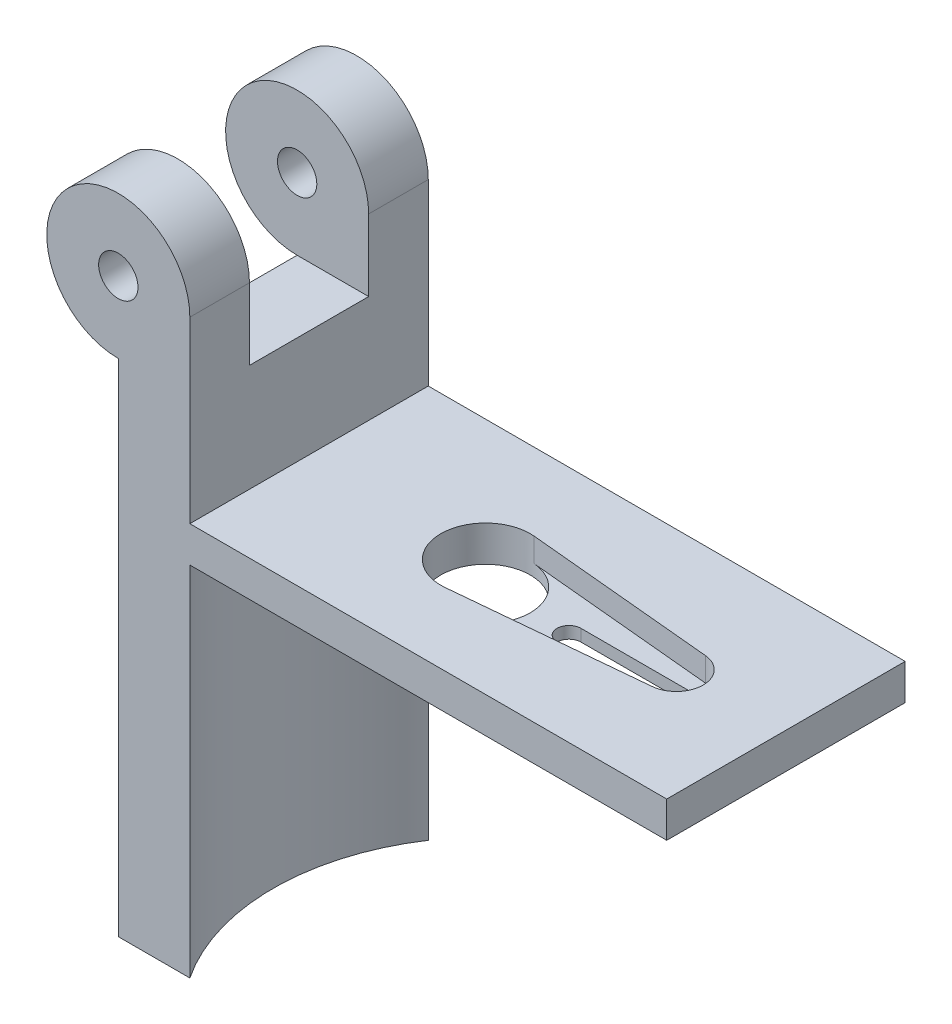
ISO-10303-21;
HEADER;
FILE_DESCRIPTION(('STEP AP214'),'2;1');
FILE_NAME('part.step','',(''),(''),'','','');
FILE_SCHEMA(('AUTOMOTIVE_DESIGN { 1 0 10303 214 1 1 1 1 }'));
ENDSEC;
DATA;
#1=APPLICATION_CONTEXT('core data for automotive mechanical design processes');
#2=APPLICATION_PROTOCOL_DEFINITION('international standard','automotive_design',2000,#1);
#3=PRODUCT_CONTEXT('',#1,'mechanical');
#4=PRODUCT('Part','Part','',(#3));
#5=PRODUCT_RELATED_PRODUCT_CATEGORY('part','',(#4));
#6=PRODUCT_DEFINITION_FORMATION('','',#4);
#7=PRODUCT_DEFINITION_CONTEXT('part definition',#1,'design');
#8=PRODUCT_DEFINITION('design','',#6,#7);
#9=PRODUCT_DEFINITION_SHAPE('','',#8);
#10=(LENGTH_UNIT() NAMED_UNIT(*) SI_UNIT(.MILLI.,.METRE.));
#11=(NAMED_UNIT(*) PLANE_ANGLE_UNIT() SI_UNIT($,.RADIAN.));
#12=(NAMED_UNIT(*) SI_UNIT($,.STERADIAN.) SOLID_ANGLE_UNIT());
#13=UNCERTAINTY_MEASURE_WITH_UNIT(LENGTH_MEASURE(1.E-05),#10,'distance_accuracy_value','');
#14=(GEOMETRIC_REPRESENTATION_CONTEXT(3) GLOBAL_UNCERTAINTY_ASSIGNED_CONTEXT((#13)) GLOBAL_UNIT_ASSIGNED_CONTEXT((#10,
#11,#12)) REPRESENTATION_CONTEXT('',''));
#15=CARTESIAN_POINT('',(0.,0.,0.));
#16=DIRECTION('',(0.,0.,1.));
#17=DIRECTION('',(1.,0.,0.));
#18=AXIS2_PLACEMENT_3D('',#15,#16,#17);
#19=CARTESIAN_POINT('',(0.,0.,20.));
#20=DIRECTION('',(0.,0.,-1.));
#21=DIRECTION('',(-1.,0.,0.));
#22=AXIS2_PLACEMENT_3D('',#19,#20,#21);
#23=CYLINDRICAL_SURFACE('',#22,6.);
#24=DIRECTION('',(0.,0.,-1.));
#25=VECTOR('',#24,1.);
#26=CARTESIAN_POINT('',(6.,0.,20.));
#27=LINE('',#26,#25);
#28=CARTESIAN_POINT('',(6.,0.,20.));
#29=VERTEX_POINT('',#28);
#30=CARTESIAN_POINT('',(6.,0.,15.));
#31=VERTEX_POINT('',#30);
#32=EDGE_CURVE('E210',#29,#31,#27,.T.);
#33=ORIENTED_EDGE('',*,*,#32,.T.);
#34=CARTESIAN_POINT('',(0.,0.,15.));
#35=DIRECTION('',(0.,0.,1.));
#36=DIRECTION('',(0.,-1.,0.));
#37=AXIS2_PLACEMENT_3D('',#34,#35,#36);
#38=CIRCLE('',#37,6.);
#39=CARTESIAN_POINT('',(0.,-6.,15.));
#40=VERTEX_POINT('',#39);
#41=EDGE_CURVE('E54',#31,#40,#38,.T.);
#42=ORIENTED_EDGE('',*,*,#41,.T.);
#43=DIRECTION('',(0.,0.,-1.));
#44=VECTOR('',#43,1.);
#45=CARTESIAN_POINT('',(0.,-6.,20.));
#46=LINE('',#45,#44);
#47=CARTESIAN_POINT('',(0.,-6.,20.));
#48=VERTEX_POINT('',#47);
#49=EDGE_CURVE('E11',#48,#40,#46,.T.);
#50=ORIENTED_EDGE('',*,*,#49,.F.);
#51=CARTESIAN_POINT('',(0.,0.,20.));
#52=DIRECTION('',(0.,0.,1.));
#53=DIRECTION('',(1.,0.,0.));
#54=AXIS2_PLACEMENT_3D('',#51,#52,#53);
#55=CIRCLE('',#54,6.);
#56=EDGE_CURVE('E209',#29,#48,#55,.T.);
#57=ORIENTED_EDGE('',*,*,#56,.F.);
#58=EDGE_LOOP('',(#33,#42,#50,#57));
#59=FACE_BOUND('',#58,.T.);
#60=ADVANCED_FACE('F37',(#59),#23,.T.);
#61=CARTESIAN_POINT('',(0.,0.,20.));
#62=DIRECTION('',(0.,0.,-1.));
#63=DIRECTION('',(-1.,0.,0.));
#64=AXIS2_PLACEMENT_3D('',#61,#62,#63);
#65=CYLINDRICAL_SURFACE('',#64,1.65);
#66=CARTESIAN_POINT('',(0.,0.,5.));
#67=DIRECTION('',(0.,0.,-1.));
#68=DIRECTION('',(0.,1.,0.));
#69=AXIS2_PLACEMENT_3D('',#66,#67,#68);
#70=CIRCLE('',#69,1.65);
#71=CARTESIAN_POINT('',(0.,1.65,5.));
#72=VERTEX_POINT('',#71);
#73=EDGE_CURVE('E41',#72,#72,#70,.T.);
#74=ORIENTED_EDGE('',*,*,#73,.F.);
#75=EDGE_LOOP('',(#74));
#76=FACE_BOUND('',#75,.T.);
#77=CARTESIAN_POINT('',(0.,0.,0.));
#78=DIRECTION('',(0.,0.,1.));
#79=DIRECTION('',(1.,0.,0.));
#80=AXIS2_PLACEMENT_3D('',#77,#78,#79);
#81=CIRCLE('',#80,1.65);
#82=CARTESIAN_POINT('',(1.65,0.,0.));
#83=VERTEX_POINT('',#82);
#84=EDGE_CURVE('E206',#83,#83,#81,.T.);
#85=ORIENTED_EDGE('',*,*,#84,.F.);
#86=EDGE_LOOP('',(#85));
#87=FACE_BOUND('',#86,.T.);
#88=ADVANCED_FACE('F369',(#76,#87),#65,.F.);
#89=CARTESIAN_POINT('',(0.,-15.,20.));
#90=DIRECTION('',(0.,1.,0.));
#91=DIRECTION('',(-1.,0.,0.));
#92=AXIS2_PLACEMENT_3D('',#89,#90,#91);
#93=PLANE('',#92);
#94=CARTESIAN_POINT('',(21.,-15.,10.1967119490392));
#95=DIRECTION('',(0.,1.,0.));
#96=DIRECTION('',(-1.,0.,0.));
#97=AXIS2_PLACEMENT_3D('',#94,#95,#96);
#98=CIRCLE('',#97,3.75);
#99=CARTESIAN_POINT('',(21.3515625,-15.,6.46322781105307));
#100=VERTEX_POINT('',#99);
#101=CARTESIAN_POINT('',(21.3515625,-15.,13.9301960870253));
#102=VERTEX_POINT('',#101);
#103=EDGE_CURVE('E274',#100,#102,#98,.T.);
#104=ORIENTED_EDGE('',*,*,#103,.F.);
#105=DIRECTION('',(-0.995595770129625,0.,-0.0937499999999999));
#106=VECTOR('',#105,1.);
#107=CARTESIAN_POINT('',(-0.415598745533773,-15.,4.41352909999577));
#108=LINE('',#107,#106);
#109=CARTESIAN_POINT('',(37.2109375,-15.,7.9566214662475));
#110=VERTEX_POINT('',#109);
#111=EDGE_CURVE('E283',#110,#100,#108,.T.);
#112=ORIENTED_EDGE('',*,*,#111,.F.);
#113=CARTESIAN_POINT('',(37.,-15.,10.1967119490392));
#114=DIRECTION('',(0.,1.,0.));
#115=DIRECTION('',(-1.,0.,0.));
#116=AXIS2_PLACEMENT_3D('',#113,#114,#115);
#117=CIRCLE('',#116,2.25);
#118=CARTESIAN_POINT('',(37.2109375,-15.,12.4368024318308));
#119=VERTEX_POINT('',#118);
#120=EDGE_CURVE('E295',#119,#110,#117,.T.);
#121=ORIENTED_EDGE('',*,*,#120,.F.);
#122=DIRECTION('',(-0.995595770129625,0.,0.0937500000000001));
#123=VECTOR('',#122,1.);
#124=CARTESIAN_POINT('',(1.48786437053378,-15.,15.8006557208533));
#125=LINE('',#124,#123);
#126=EDGE_CURVE('E278',#119,#102,#125,.T.);
#127=ORIENTED_EDGE('',*,*,#126,.T.);
#128=EDGE_LOOP('',(#104,#112,#121,#127));
#129=FACE_BOUND('',#128,.T.);
#130=DIRECTION('',(1.,0.,0.));
#131=VECTOR('',#130,1.);
#132=CARTESIAN_POINT('',(0.,-15.,0.));
#133=LINE('',#132,#131);
#134=CARTESIAN_POINT('',(6.,-15.,0.));
#135=VERTEX_POINT('',#134);
#136=CARTESIAN_POINT('',(46.,-15.,0.));
#137=VERTEX_POINT('',#136);
#138=EDGE_CURVE('E201',#135,#137,#133,.T.);
#139=ORIENTED_EDGE('',*,*,#138,.F.);
#140=DIRECTION('',(0.,0.,-1.));
#141=VECTOR('',#140,1.);
#142=CARTESIAN_POINT('',(6.,-15.,20.));
#143=LINE('',#142,#141);
#144=CARTESIAN_POINT('',(6.,-15.,20.));
#145=VERTEX_POINT('',#144);
#146=EDGE_CURVE('E213',#145,#135,#143,.T.);
#147=ORIENTED_EDGE('',*,*,#146,.F.);
#148=DIRECTION('',(1.,0.,0.));
#149=VECTOR('',#148,1.);
#150=CARTESIAN_POINT('',(0.,-15.,20.));
#151=LINE('',#150,#149);
#152=CARTESIAN_POINT('',(46.,-15.,20.));
#153=VERTEX_POINT('',#152);
#154=EDGE_CURVE('E323',#145,#153,#151,.T.);
#155=ORIENTED_EDGE('',*,*,#154,.T.);
#156=DIRECTION('',(0.,0.,-1.));
#157=VECTOR('',#156,1.);
#158=CARTESIAN_POINT('',(46.,-15.,20.));
#159=LINE('',#158,#157);
#160=EDGE_CURVE('E216',#153,#137,#159,.T.);
#161=ORIENTED_EDGE('',*,*,#160,.T.);
#162=EDGE_LOOP('',(#139,#147,#155,#161));
#163=FACE_BOUND('',#162,.T.);
#164=ADVANCED_FACE('F350',(#129,#163),#93,.T.);
#165=CARTESIAN_POINT('',(0.,-6.,5.));
#166=VERTEX_POINT('',#165);
#167=CARTESIAN_POINT('',(0.,-6.,0.));
#168=VERTEX_POINT('',#167);
#169=EDGE_CURVE('E46',#166,#168,#46,.T.);
#170=ORIENTED_EDGE('',*,*,#169,.F.);
#171=CARTESIAN_POINT('',(0.,0.,5.));
#172=DIRECTION('',(0.,0.,-1.));
#173=DIRECTION('',(0.,1.,0.));
#174=AXIS2_PLACEMENT_3D('',#171,#172,#173);
#175=CIRCLE('',#174,6.);
#176=CARTESIAN_POINT('',(6.,0.,5.));
#177=VERTEX_POINT('',#176);
#178=EDGE_CURVE('E239',#166,#177,#175,.T.);
#179=ORIENTED_EDGE('',*,*,#178,.T.);
#180=CARTESIAN_POINT('',(6.,0.,0.));
#181=VERTEX_POINT('',#180);
#182=EDGE_CURVE('E214',#177,#181,#27,.T.);
#183=ORIENTED_EDGE('',*,*,#182,.T.);
#184=CARTESIAN_POINT('',(0.,0.,0.));
#185=DIRECTION('',(0.,0.,1.));
#186=DIRECTION('',(1.,0.,0.));
#187=AXIS2_PLACEMENT_3D('',#184,#185,#186);
#188=CIRCLE('',#187,6.);
#189=EDGE_CURVE('E302',#181,#168,#188,.T.);
#190=ORIENTED_EDGE('',*,*,#189,.T.);
#191=EDGE_LOOP('',(#170,#179,#183,#190));
#192=FACE_BOUND('',#191,.T.);
#193=ADVANCED_FACE('F39',(#192),#23,.T.);
#194=CARTESIAN_POINT('',(0.,0.,20.));
#195=DIRECTION('',(1.,0.,0.));
#196=DIRECTION('',(0.,1.,0.));
#197=AXIS2_PLACEMENT_3D('',#194,#195,#196);
#198=PLANE('',#197);
#199=DIRECTION('',(0.,-1.,0.));
#200=VECTOR('',#199,1.);
#201=CARTESIAN_POINT('',(0.,0.,0.));
#202=LINE('',#201,#200);
#203=CARTESIAN_POINT('',(0.,-48.,0.));
#204=VERTEX_POINT('',#203);
#205=EDGE_CURVE('E331',#168,#204,#202,.T.);
#206=ORIENTED_EDGE('',*,*,#205,.T.);
#207=DIRECTION('',(0.,0.,-1.));
#208=VECTOR('',#207,1.);
#209=CARTESIAN_POINT('',(0.,-48.,20.));
#210=LINE('',#209,#208);
#211=CARTESIAN_POINT('',(0.,-48.,20.));
#212=VERTEX_POINT('',#211);
#213=EDGE_CURVE('E220',#212,#204,#210,.T.);
#214=ORIENTED_EDGE('',*,*,#213,.F.);
#215=DIRECTION('',(0.,-1.,0.));
#216=VECTOR('',#215,1.);
#217=CARTESIAN_POINT('',(0.,0.,20.));
#218=LINE('',#217,#216);
#219=EDGE_CURVE('E311',#48,#212,#218,.T.);
#220=ORIENTED_EDGE('',*,*,#219,.F.);
#221=ORIENTED_EDGE('',*,*,#49,.T.);
#222=DIRECTION('',(0.,0.,-1.));
#223=VECTOR('',#222,1.);
#224=CARTESIAN_POINT('',(0.,-6.,20.));
#225=LINE('',#224,#223);
#226=EDGE_CURVE('E241',#40,#166,#225,.T.);
#227=ORIENTED_EDGE('',*,*,#226,.T.);
#228=ORIENTED_EDGE('',*,*,#169,.T.);
#229=EDGE_LOOP('',(#206,#214,#220,#221,#227,#228));
#230=FACE_BOUND('',#229,.T.);
#231=ADVANCED_FACE('F361',(#230),#198,.F.);
#232=CARTESIAN_POINT('',(0.,-48.,20.));
#233=DIRECTION('',(0.,1.,0.));
#234=DIRECTION('',(0.,0.,1.));
#235=AXIS2_PLACEMENT_3D('',#232,#233,#234);
#236=PLANE('',#235);
#237=DIRECTION('',(1.,0.,0.));
#238=VECTOR('',#237,1.);
#239=CARTESIAN_POINT('',(0.,-48.,0.));
#240=LINE('',#239,#238);
#241=CARTESIAN_POINT('',(6.00000000000001,-48.,0.));
#242=VERTEX_POINT('',#241);
#243=EDGE_CURVE('E182',#204,#242,#240,.T.);
#244=ORIENTED_EDGE('',*,*,#243,.T.);
#245=CARTESIAN_POINT('',(21.0575952665761,-48.,10.));
#246=DIRECTION('',(0.,-1.,0.));
#247=DIRECTION('',(0.,0.,-1.));
#248=AXIS2_PLACEMENT_3D('',#245,#246,#247);
#249=CIRCLE('',#248,18.0757067693635);
#250=CARTESIAN_POINT('',(6.,-48.,20.));
#251=VERTEX_POINT('',#250);
#252=EDGE_CURVE('E176',#251,#242,#249,.T.);
#253=ORIENTED_EDGE('',*,*,#252,.F.);
#254=DIRECTION('',(1.,0.,0.));
#255=VECTOR('',#254,1.);
#256=CARTESIAN_POINT('',(0.,-48.,20.));
#257=LINE('',#256,#255);
#258=EDGE_CURVE('E313',#212,#251,#257,.T.);
#259=ORIENTED_EDGE('',*,*,#258,.F.);
#260=ORIENTED_EDGE('',*,*,#213,.T.);
#261=EDGE_LOOP('',(#244,#253,#259,#260));
#262=FACE_BOUND('',#261,.T.);
#263=ADVANCED_FACE('F333',(#262),#236,.F.);
#264=CARTESIAN_POINT('',(0.,-18.,20.));
#265=DIRECTION('',(0.,1.,0.));
#266=DIRECTION('',(0.,0.,1.));
#267=AXIS2_PLACEMENT_3D('',#264,#265,#266);
#268=PLANE('',#267);
#269=DIRECTION('',(-1.,0.,0.));
#270=VECTOR('',#269,1.);
#271=CARTESIAN_POINT('',(0.,-18.,9.19671194903915));
#272=LINE('',#271,#270);
#273=CARTESIAN_POINT('',(37.,-18.,9.19671194903916));
#274=VERTEX_POINT('',#273);
#275=CARTESIAN_POINT('',(28.,-18.,9.19671194903916));
#276=VERTEX_POINT('',#275);
#277=EDGE_CURVE('E268',#274,#276,#272,.T.);
#278=ORIENTED_EDGE('',*,*,#277,.T.);
#279=CARTESIAN_POINT('',(28.,-18.,10.1967119490392));
#280=DIRECTION('',(0.,1.,0.));
#281=DIRECTION('',(0.,0.,1.));
#282=AXIS2_PLACEMENT_3D('',#279,#280,#281);
#283=CIRCLE('',#282,1.);
#284=CARTESIAN_POINT('',(28.,-18.,11.1967119490392));
#285=VERTEX_POINT('',#284);
#286=EDGE_CURVE('E271',#276,#285,#283,.T.);
#287=ORIENTED_EDGE('',*,*,#286,.T.);
#288=DIRECTION('',(1.,0.,0.));
#289=VECTOR('',#288,1.);
#290=CARTESIAN_POINT('',(0.,-18.,11.1967119490392));
#291=LINE('',#290,#289);
#292=CARTESIAN_POINT('',(37.,-18.,11.1967119490392));
#293=VERTEX_POINT('',#292);
#294=EDGE_CURVE('E257',#285,#293,#291,.T.);
#295=ORIENTED_EDGE('',*,*,#294,.T.);
#296=CARTESIAN_POINT('',(37.,-18.,10.1967119490392));
#297=DIRECTION('',(0.,1.,0.));
#298=DIRECTION('',(0.,0.,1.));
#299=AXIS2_PLACEMENT_3D('',#296,#297,#298);
#300=CIRCLE('',#299,0.999999999999999);
#301=EDGE_CURVE('E265',#293,#274,#300,.T.);
#302=ORIENTED_EDGE('',*,*,#301,.T.);
#303=EDGE_LOOP('',(#278,#287,#295,#302));
#304=FACE_BOUND('',#303,.T.);
#305=CARTESIAN_POINT('',(21.,-18.,10.1967119490392));
#306=DIRECTION('',(0.,1.,0.));
#307=DIRECTION('',(-1.,0.,0.));
#308=AXIS2_PLACEMENT_3D('',#305,#306,#307);
#309=CIRCLE('',#308,3.75);
#310=CARTESIAN_POINT('',(17.25,-18.,10.1967119490392));
#311=VERTEX_POINT('',#310);
#312=EDGE_CURVE('E275',#311,#311,#309,.T.);
#313=ORIENTED_EDGE('',*,*,#312,.T.);
#314=EDGE_LOOP('',(#313));
#315=FACE_BOUND('',#314,.T.);
#316=DIRECTION('',(1.,0.,0.));
#317=VECTOR('',#316,1.);
#318=CARTESIAN_POINT('',(0.,-18.,0.));
#319=LINE('',#318,#317);
#320=CARTESIAN_POINT('',(6.,-18.,0.));
#321=VERTEX_POINT('',#320);
#322=CARTESIAN_POINT('',(46.,-18.,0.));
#323=VERTEX_POINT('',#322);
#324=EDGE_CURVE('E181',#321,#323,#319,.T.);
#325=ORIENTED_EDGE('',*,*,#324,.T.);
#326=DIRECTION('',(0.,0.,-1.));
#327=VECTOR('',#326,1.);
#328=CARTESIAN_POINT('',(46.,-18.,20.));
#329=LINE('',#328,#327);
#330=CARTESIAN_POINT('',(46.,-18.,20.));
#331=VERTEX_POINT('',#330);
#332=EDGE_CURVE('E218',#331,#323,#329,.T.);
#333=ORIENTED_EDGE('',*,*,#332,.F.);
#334=DIRECTION('',(1.,0.,0.));
#335=VECTOR('',#334,1.);
#336=CARTESIAN_POINT('',(0.,-18.,20.));
#337=LINE('',#336,#335);
#338=CARTESIAN_POINT('',(6.,-18.,20.));
#339=VERTEX_POINT('',#338);
#340=EDGE_CURVE('E190',#339,#331,#337,.T.);
#341=ORIENTED_EDGE('',*,*,#340,.F.);
#342=CARTESIAN_POINT('',(21.0575952665761,-18.,10.));
#343=DIRECTION('',(0.,-1.,0.));
#344=DIRECTION('',(0.,0.,-1.));
#345=AXIS2_PLACEMENT_3D('',#342,#343,#344);
#346=CIRCLE('',#345,18.0757067693635);
#347=EDGE_CURVE('E173',#339,#321,#346,.T.);
#348=ORIENTED_EDGE('',*,*,#347,.T.);
#349=EDGE_LOOP('',(#325,#333,#341,#348));
#350=FACE_BOUND('',#349,.T.);
#351=ADVANCED_FACE('F187',(#304,#315,#350),#268,.F.);
#352=CARTESIAN_POINT('',(46.,1.06396373193244E-13,20.));
#353=DIRECTION('',(1.,0.,0.));
#354=DIRECTION('',(0.,1.,0.));
#355=AXIS2_PLACEMENT_3D('',#352,#353,#354);
#356=PLANE('',#355);
#357=DIRECTION('',(0.,-1.,0.));
#358=VECTOR('',#357,1.);
#359=CARTESIAN_POINT('',(46.,1.06396373193244E-13,0.));
#360=LINE('',#359,#358);
#361=EDGE_CURVE('E199',#137,#323,#360,.T.);
#362=ORIENTED_EDGE('',*,*,#361,.F.);
#363=ORIENTED_EDGE('',*,*,#160,.F.);
#364=DIRECTION('',(0.,-1.,0.));
#365=VECTOR('',#364,1.);
#366=CARTESIAN_POINT('',(46.,1.06396373193244E-13,20.));
#367=LINE('',#366,#365);
#368=EDGE_CURVE('E320',#153,#331,#367,.T.);
#369=ORIENTED_EDGE('',*,*,#368,.T.);
#370=ORIENTED_EDGE('',*,*,#332,.T.);
#371=EDGE_LOOP('',(#362,#363,#369,#370));
#372=FACE_BOUND('',#371,.T.);
#373=ADVANCED_FACE('F354',(#372),#356,.T.);
#374=CARTESIAN_POINT('',(6.,0.,20.));
#375=DIRECTION('',(1.,0.,0.));
#376=DIRECTION('',(0.,1.,0.));
#377=AXIS2_PLACEMENT_3D('',#374,#375,#376);
#378=PLANE('',#377);
#379=DIRECTION('',(0.,1.,0.));
#380=VECTOR('',#379,1.);
#381=CARTESIAN_POINT('',(6.,6.,5.));
#382=LINE('',#381,#380);
#383=CARTESIAN_POINT('',(6.,-6.,5.));
#384=VERTEX_POINT('',#383);
#385=EDGE_CURVE('E192',#384,#177,#382,.T.);
#386=ORIENTED_EDGE('',*,*,#385,.F.);
#387=DIRECTION('',(0.,0.,-1.));
#388=VECTOR('',#387,1.);
#389=CARTESIAN_POINT('',(6.,-6.,15.));
#390=LINE('',#389,#388);
#391=CARTESIAN_POINT('',(6.,-6.,15.));
#392=VERTEX_POINT('',#391);
#393=EDGE_CURVE('E234',#392,#384,#390,.T.);
#394=ORIENTED_EDGE('',*,*,#393,.F.);
#395=DIRECTION('',(0.,-1.,0.));
#396=VECTOR('',#395,1.);
#397=CARTESIAN_POINT('',(6.,6.,15.));
#398=LINE('',#397,#396);
#399=EDGE_CURVE('E378',#31,#392,#398,.T.);
#400=ORIENTED_EDGE('',*,*,#399,.F.);
#401=ORIENTED_EDGE('',*,*,#32,.F.);
#402=DIRECTION('',(0.,-1.,0.));
#403=VECTOR('',#402,1.);
#404=CARTESIAN_POINT('',(6.,0.,20.));
#405=LINE('',#404,#403);
#406=EDGE_CURVE('E318',#29,#145,#405,.T.);
#407=ORIENTED_EDGE('',*,*,#406,.T.);
#408=ORIENTED_EDGE('',*,*,#146,.T.);
#409=DIRECTION('',(0.,-1.,0.));
#410=VECTOR('',#409,1.);
#411=CARTESIAN_POINT('',(6.,0.,0.));
#412=LINE('',#411,#410);
#413=EDGE_CURVE('E184',#181,#135,#412,.T.);
#414=ORIENTED_EDGE('',*,*,#413,.F.);
#415=ORIENTED_EDGE('',*,*,#182,.F.);
#416=EDGE_LOOP('',(#386,#394,#400,#401,#407,#408,#414,#415));
#417=FACE_BOUND('',#416,.T.);
#418=ADVANCED_FACE('F345',(#417),#378,.T.);
#419=CARTESIAN_POINT('',(0.,0.,15.));
#420=DIRECTION('',(0.,0.,1.));
#421=DIRECTION('',(0.,-1.,0.));
#422=AXIS2_PLACEMENT_3D('',#419,#420,#421);
#423=CIRCLE('',#422,1.65);
#424=CARTESIAN_POINT('',(0.,-1.65,15.));
#425=VERTEX_POINT('',#424);
#426=EDGE_CURVE('E222',#425,#425,#423,.T.);
#427=ORIENTED_EDGE('',*,*,#426,.F.);
#428=EDGE_LOOP('',(#427));
#429=FACE_BOUND('',#428,.T.);
#430=CARTESIAN_POINT('',(0.,0.,20.));
#431=DIRECTION('',(0.,0.,1.));
#432=DIRECTION('',(1.,0.,0.));
#433=AXIS2_PLACEMENT_3D('',#430,#431,#432);
#434=CIRCLE('',#433,1.65);
#435=CARTESIAN_POINT('',(1.65,0.,20.));
#436=VERTEX_POINT('',#435);
#437=EDGE_CURVE('E326',#436,#436,#434,.T.);
#438=ORIENTED_EDGE('',*,*,#437,.T.);
#439=EDGE_LOOP('',(#438));
#440=FACE_BOUND('',#439,.T.);
#441=ADVANCED_FACE('F376',(#429,#440),#65,.F.);
#442=CARTESIAN_POINT('',(0.,0.,20.));
#443=DIRECTION('',(0.,0.,1.));
#444=DIRECTION('',(1.,0.,0.));
#445=AXIS2_PLACEMENT_3D('',#442,#443,#444);
#446=PLANE('',#445);
#447=ORIENTED_EDGE('',*,*,#56,.T.);
#448=ORIENTED_EDGE('',*,*,#219,.T.);
#449=ORIENTED_EDGE('',*,*,#258,.T.);
#450=EDGE_CURVE('E316',#339,#251,#405,.T.);
#451=ORIENTED_EDGE('',*,*,#450,.F.);
#452=ORIENTED_EDGE('',*,*,#340,.T.);
#453=ORIENTED_EDGE('',*,*,#368,.F.);
#454=ORIENTED_EDGE('',*,*,#154,.F.);
#455=ORIENTED_EDGE('',*,*,#406,.F.);
#456=EDGE_LOOP('',(#447,#448,#449,#451,#452,#453,#454,#455));
#457=FACE_BOUND('',#456,.T.);
#458=ORIENTED_EDGE('',*,*,#437,.F.);
#459=EDGE_LOOP('',(#458));
#460=FACE_BOUND('',#459,.T.);
#461=ADVANCED_FACE('F356',(#457,#460),#446,.T.);
#462=CARTESIAN_POINT('',(0.,0.,0.));
#463=DIRECTION('',(0.,0.,1.));
#464=DIRECTION('',(1.,0.,0.));
#465=AXIS2_PLACEMENT_3D('',#462,#463,#464);
#466=PLANE('',#465);
#467=ORIENTED_EDGE('',*,*,#189,.F.);
#468=ORIENTED_EDGE('',*,*,#413,.T.);
#469=ORIENTED_EDGE('',*,*,#138,.T.);
#470=ORIENTED_EDGE('',*,*,#361,.T.);
#471=ORIENTED_EDGE('',*,*,#324,.F.);
#472=EDGE_CURVE('E170',#321,#242,#412,.T.);
#473=ORIENTED_EDGE('',*,*,#472,.T.);
#474=ORIENTED_EDGE('',*,*,#243,.F.);
#475=ORIENTED_EDGE('',*,*,#205,.F.);
#476=EDGE_LOOP('',(#467,#468,#469,#470,#471,#473,#474,#475));
#477=FACE_BOUND('',#476,.T.);
#478=ORIENTED_EDGE('',*,*,#84,.T.);
#479=EDGE_LOOP('',(#478));
#480=FACE_BOUND('',#479,.T.);
#481=ADVANCED_FACE('F195',(#477,#480),#466,.F.);
#482=CARTESIAN_POINT('',(-0.415598745533773,-17.,4.41352909999577));
#483=DIRECTION('',(0.0937499999999999,0.,-0.995595770129625));
#484=DIRECTION('',(-0.995595770129625,0.,-0.0937499999999999));
#485=AXIS2_PLACEMENT_3D('',#482,#483,#484);
#486=PLANE('',#485);
#487=ORIENTED_EDGE('',*,*,#111,.T.);
#488=DIRECTION('',(0.,1.,0.));
#489=VECTOR('',#488,1.);
#490=CARTESIAN_POINT('',(21.3515625,-17.,6.46322781105307));
#491=LINE('',#490,#489);
#492=CARTESIAN_POINT('',(21.3515625,-17.,6.46322781105306));
#493=VERTEX_POINT('',#492);
#494=EDGE_CURVE('E300',#493,#100,#491,.T.);
#495=ORIENTED_EDGE('',*,*,#494,.F.);
#496=DIRECTION('',(-0.995595770129625,0.,-0.0937499999999999));
#497=VECTOR('',#496,1.);
#498=CARTESIAN_POINT('',(-0.415598745533773,-17.,4.41352909999577));
#499=LINE('',#498,#497);
#500=CARTESIAN_POINT('',(37.2109375,-17.,7.9566214662475));
#501=VERTEX_POINT('',#500);
#502=EDGE_CURVE('E289',#501,#493,#499,.T.);
#503=ORIENTED_EDGE('',*,*,#502,.F.);
#504=DIRECTION('',(0.,1.,0.));
#505=VECTOR('',#504,1.);
#506=CARTESIAN_POINT('',(37.2109375,-17.,7.9566214662475));
#507=LINE('',#506,#505);
#508=EDGE_CURVE('E303',#501,#110,#507,.T.);
#509=ORIENTED_EDGE('',*,*,#508,.T.);
#510=EDGE_LOOP('',(#487,#495,#503,#509));
#511=FACE_BOUND('',#510,.T.);
#512=ADVANCED_FACE('F420',(#511),#486,.F.);
#513=CARTESIAN_POINT('',(37.,-17.,10.1967119490392));
#514=DIRECTION('',(0.,1.,0.));
#515=DIRECTION('',(-1.,0.,0.));
#516=AXIS2_PLACEMENT_3D('',#513,#514,#515);
#517=CYLINDRICAL_SURFACE('',#516,2.25);
#518=ORIENTED_EDGE('',*,*,#120,.T.);
#519=ORIENTED_EDGE('',*,*,#508,.F.);
#520=CARTESIAN_POINT('',(37.,-17.,10.1967119490392));
#521=DIRECTION('',(0.,1.,0.));
#522=DIRECTION('',(-1.,0.,0.));
#523=AXIS2_PLACEMENT_3D('',#520,#521,#522);
#524=CIRCLE('',#523,2.25);
#525=CARTESIAN_POINT('',(37.2109375,-17.,12.4368024318308));
#526=VERTEX_POINT('',#525);
#527=EDGE_CURVE('E286',#526,#501,#524,.T.);
#528=ORIENTED_EDGE('',*,*,#527,.F.);
#529=DIRECTION('',(0.,1.,0.));
#530=VECTOR('',#529,1.);
#531=CARTESIAN_POINT('',(37.2109375,-17.,12.4368024318308));
#532=LINE('',#531,#530);
#533=EDGE_CURVE('E305',#526,#119,#532,.T.);
#534=ORIENTED_EDGE('',*,*,#533,.T.);
#535=EDGE_LOOP('',(#518,#519,#528,#534));
#536=FACE_BOUND('',#535,.T.);
#537=ADVANCED_FACE('F423',(#536),#517,.F.);
#538=CARTESIAN_POINT('',(1.48786437053378,-17.,15.8006557208533));
#539=DIRECTION('',(-0.0937500000000001,0.,-0.995595770129625));
#540=DIRECTION('',(-0.995595770129625,0.,0.0937500000000001));
#541=AXIS2_PLACEMENT_3D('',#538,#539,#540);
#542=PLANE('',#541);
#543=ORIENTED_EDGE('',*,*,#126,.F.);
#544=ORIENTED_EDGE('',*,*,#533,.F.);
#545=DIRECTION('',(-0.995595770129625,0.,0.0937500000000001));
#546=VECTOR('',#545,1.);
#547=CARTESIAN_POINT('',(1.48786437053378,-17.,15.8006557208533));
#548=LINE('',#547,#546);
#549=CARTESIAN_POINT('',(21.3515625,-17.,13.9301960870253));
#550=VERTEX_POINT('',#549);
#551=EDGE_CURVE('E282',#526,#550,#548,.T.);
#552=ORIENTED_EDGE('',*,*,#551,.T.);
#553=DIRECTION('',(0.,1.,0.));
#554=VECTOR('',#553,1.);
#555=CARTESIAN_POINT('',(21.3515625,-17.,13.9301960870253));
#556=LINE('',#555,#554);
#557=EDGE_CURVE('E292',#550,#102,#556,.T.);
#558=ORIENTED_EDGE('',*,*,#557,.T.);
#559=EDGE_LOOP('',(#543,#544,#552,#558));
#560=FACE_BOUND('',#559,.T.);
#561=ADVANCED_FACE('F418',(#560),#542,.T.);
#562=CARTESIAN_POINT('',(0.,-17.,0.));
#563=DIRECTION('',(0.,1.,0.));
#564=DIRECTION('',(-1.,0.,0.));
#565=AXIS2_PLACEMENT_3D('',#562,#563,#564);
#566=PLANE('',#565);
#567=CARTESIAN_POINT('',(28.,-17.,10.1967119490392));
#568=DIRECTION('',(0.,1.,0.));
#569=DIRECTION('',(-1.,0.,0.));
#570=AXIS2_PLACEMENT_3D('',#567,#568,#569);
#571=CIRCLE('',#570,1.);
#572=CARTESIAN_POINT('',(28.,-17.,9.19671194903916));
#573=VERTEX_POINT('',#572);
#574=CARTESIAN_POINT('',(28.,-17.,11.1967119490392));
#575=VERTEX_POINT('',#574);
#576=EDGE_CURVE('E244',#573,#575,#571,.T.);
#577=ORIENTED_EDGE('',*,*,#576,.F.);
#578=DIRECTION('',(-1.,0.,0.));
#579=VECTOR('',#578,1.);
#580=CARTESIAN_POINT('',(28.,-17.,9.19671194903916));
#581=LINE('',#580,#579);
#582=CARTESIAN_POINT('',(37.,-17.,9.19671194903916));
#583=VERTEX_POINT('',#582);
#584=EDGE_CURVE('E251',#583,#573,#581,.T.);
#585=ORIENTED_EDGE('',*,*,#584,.F.);
#586=CARTESIAN_POINT('',(37.,-17.,10.1967119490392));
#587=DIRECTION('',(0.,1.,0.));
#588=DIRECTION('',(-1.,0.,0.));
#589=AXIS2_PLACEMENT_3D('',#586,#587,#588);
#590=CIRCLE('',#589,0.999999999999999);
#591=CARTESIAN_POINT('',(37.,-17.,11.1967119490392));
#592=VERTEX_POINT('',#591);
#593=EDGE_CURVE('E248',#592,#583,#590,.T.);
#594=ORIENTED_EDGE('',*,*,#593,.F.);
#595=DIRECTION('',(1.,0.,0.));
#596=VECTOR('',#595,1.);
#597=CARTESIAN_POINT('',(28.,-17.,11.1967119490392));
#598=LINE('',#597,#596);
#599=EDGE_CURVE('E246',#575,#592,#598,.T.);
#600=ORIENTED_EDGE('',*,*,#599,.F.);
#601=EDGE_LOOP('',(#577,#585,#594,#600));
#602=FACE_BOUND('',#601,.T.);
#603=CARTESIAN_POINT('',(21.,-17.,10.1967119490392));
#604=DIRECTION('',(0.,1.,0.));
#605=DIRECTION('',(-1.,0.,0.));
#606=AXIS2_PLACEMENT_3D('',#603,#604,#605);
#607=CIRCLE('',#606,3.75);
#608=EDGE_CURVE('E280',#550,#493,#607,.T.);
#609=ORIENTED_EDGE('',*,*,#608,.F.);
#610=ORIENTED_EDGE('',*,*,#551,.F.);
#611=ORIENTED_EDGE('',*,*,#527,.T.);
#612=ORIENTED_EDGE('',*,*,#502,.T.);
#613=EDGE_LOOP('',(#609,#610,#611,#612));
#614=FACE_BOUND('',#613,.T.);
#615=ADVANCED_FACE('F414',(#602,#614),#566,.T.);
#616=CARTESIAN_POINT('',(21.,-18.,10.1967119490392));
#617=DIRECTION('',(0.,1.,0.));
#618=DIRECTION('',(-1.,0.,0.));
#619=AXIS2_PLACEMENT_3D('',#616,#617,#618);
#620=CYLINDRICAL_SURFACE('',#619,3.75);
#621=ORIENTED_EDGE('',*,*,#494,.T.);
#622=ORIENTED_EDGE('',*,*,#103,.T.);
#623=ORIENTED_EDGE('',*,*,#557,.F.);
#624=ORIENTED_EDGE('',*,*,#608,.T.);
#625=EDGE_LOOP('',(#621,#622,#623,#624));
#626=FACE_BOUND('',#625,.T.);
#627=ORIENTED_EDGE('',*,*,#312,.F.);
#628=EDGE_LOOP('',(#627));
#629=FACE_BOUND('',#628,.T.);
#630=ADVANCED_FACE('F410',(#626,#629),#620,.F.);
#631=CARTESIAN_POINT('',(28.,-20.,10.1967119490392));
#632=DIRECTION('',(0.,1.,0.));
#633=DIRECTION('',(-1.,0.,0.));
#634=AXIS2_PLACEMENT_3D('',#631,#632,#633);
#635=CYLINDRICAL_SURFACE('',#634,1.);
#636=DIRECTION('',(0.,1.,0.));
#637=VECTOR('',#636,1.);
#638=CARTESIAN_POINT('',(28.,-20.,9.19671194903916));
#639=LINE('',#638,#637);
#640=EDGE_CURVE('E255',#276,#573,#639,.T.);
#641=ORIENTED_EDGE('',*,*,#640,.T.);
#642=ORIENTED_EDGE('',*,*,#576,.T.);
#643=DIRECTION('',(0.,1.,0.));
#644=VECTOR('',#643,1.);
#645=CARTESIAN_POINT('',(28.,-20.,11.1967119490392));
#646=LINE('',#645,#644);
#647=EDGE_CURVE('E254',#285,#575,#646,.T.);
#648=ORIENTED_EDGE('',*,*,#647,.F.);
#649=ORIENTED_EDGE('',*,*,#286,.F.);
#650=EDGE_LOOP('',(#641,#642,#648,#649));
#651=FACE_BOUND('',#650,.T.);
#652=ADVANCED_FACE('F400',(#651),#635,.F.);
#653=CARTESIAN_POINT('',(28.,-20.,9.19671194903916));
#654=DIRECTION('',(0.,0.,-1.));
#655=DIRECTION('',(-1.,0.,0.));
#656=AXIS2_PLACEMENT_3D('',#653,#654,#655);
#657=PLANE('',#656);
#658=DIRECTION('',(0.,1.,0.));
#659=VECTOR('',#658,1.);
#660=CARTESIAN_POINT('',(37.,-20.,9.19671194903916));
#661=LINE('',#660,#659);
#662=EDGE_CURVE('E258',#274,#583,#661,.T.);
#663=ORIENTED_EDGE('',*,*,#662,.T.);
#664=ORIENTED_EDGE('',*,*,#584,.T.);
#665=ORIENTED_EDGE('',*,*,#640,.F.);
#666=ORIENTED_EDGE('',*,*,#277,.F.);
#667=EDGE_LOOP('',(#663,#664,#665,#666));
#668=FACE_BOUND('',#667,.T.);
#669=ADVANCED_FACE('F396',(#668),#657,.F.);
#670=CARTESIAN_POINT('',(37.,-20.,10.1967119490392));
#671=DIRECTION('',(0.,1.,0.));
#672=DIRECTION('',(-1.,0.,0.));
#673=AXIS2_PLACEMENT_3D('',#670,#671,#672);
#674=CYLINDRICAL_SURFACE('',#673,0.999999999999999);
#675=DIRECTION('',(0.,1.,0.));
#676=VECTOR('',#675,1.);
#677=CARTESIAN_POINT('',(37.,-20.,11.1967119490392));
#678=LINE('',#677,#676);
#679=EDGE_CURVE('E62',#293,#592,#678,.T.);
#680=ORIENTED_EDGE('',*,*,#679,.T.);
#681=ORIENTED_EDGE('',*,*,#593,.T.);
#682=ORIENTED_EDGE('',*,*,#662,.F.);
#683=ORIENTED_EDGE('',*,*,#301,.F.);
#684=EDGE_LOOP('',(#680,#681,#682,#683));
#685=FACE_BOUND('',#684,.T.);
#686=ADVANCED_FACE('F399',(#685),#674,.F.);
#687=CARTESIAN_POINT('',(28.,-20.,11.1967119490392));
#688=DIRECTION('',(0.,0.,1.));
#689=DIRECTION('',(1.,0.,0.));
#690=AXIS2_PLACEMENT_3D('',#687,#688,#689);
#691=PLANE('',#690);
#692=ORIENTED_EDGE('',*,*,#647,.T.);
#693=ORIENTED_EDGE('',*,*,#599,.T.);
#694=ORIENTED_EDGE('',*,*,#679,.F.);
#695=ORIENTED_EDGE('',*,*,#294,.F.);
#696=EDGE_LOOP('',(#692,#693,#694,#695));
#697=FACE_BOUND('',#696,.T.);
#698=ADVANCED_FACE('F404',(#697),#691,.F.);
#699=CARTESIAN_POINT('',(-6.,-6.,15.));
#700=DIRECTION('',(0.,-1.,0.));
#701=DIRECTION('',(0.,0.,-1.));
#702=AXIS2_PLACEMENT_3D('',#699,#700,#701);
#703=PLANE('',#702);
#704=DIRECTION('',(1.,0.,0.));
#705=VECTOR('',#704,1.);
#706=CARTESIAN_POINT('',(-6.,-6.,15.));
#707=LINE('',#706,#705);
#708=EDGE_CURVE('E228',#40,#392,#707,.T.);
#709=ORIENTED_EDGE('',*,*,#708,.T.);
#710=ORIENTED_EDGE('',*,*,#393,.T.);
#711=DIRECTION('',(1.,0.,0.));
#712=VECTOR('',#711,1.);
#713=CARTESIAN_POINT('',(-6.,-6.,5.));
#714=LINE('',#713,#712);
#715=EDGE_CURVE('E224',#166,#384,#714,.T.);
#716=ORIENTED_EDGE('',*,*,#715,.F.);
#717=ORIENTED_EDGE('',*,*,#226,.F.);
#718=EDGE_LOOP('',(#709,#710,#716,#717));
#719=FACE_BOUND('',#718,.T.);
#720=ADVANCED_FACE('F383',(#719),#703,.F.);
#721=CARTESIAN_POINT('',(-6.,6.,5.));
#722=DIRECTION('',(0.,0.,-1.));
#723=DIRECTION('',(0.,1.,0.));
#724=AXIS2_PLACEMENT_3D('',#721,#722,#723);
#725=PLANE('',#724);
#726=ORIENTED_EDGE('',*,*,#73,.T.);
#727=EDGE_LOOP('',(#726));
#728=FACE_BOUND('',#727,.T.);
#729=ORIENTED_EDGE('',*,*,#178,.F.);
#730=ORIENTED_EDGE('',*,*,#715,.T.);
#731=ORIENTED_EDGE('',*,*,#385,.T.);
#732=EDGE_LOOP('',(#729,#730,#731));
#733=FACE_BOUND('',#732,.T.);
#734=ADVANCED_FACE('F381',(#728,#733),#725,.F.);
#735=CARTESIAN_POINT('',(-6.,6.,15.));
#736=DIRECTION('',(0.,0.,1.));
#737=DIRECTION('',(0.,-1.,0.));
#738=AXIS2_PLACEMENT_3D('',#735,#736,#737);
#739=PLANE('',#738);
#740=ORIENTED_EDGE('',*,*,#426,.T.);
#741=EDGE_LOOP('',(#740));
#742=FACE_BOUND('',#741,.T.);
#743=ORIENTED_EDGE('',*,*,#399,.T.);
#744=ORIENTED_EDGE('',*,*,#708,.F.);
#745=ORIENTED_EDGE('',*,*,#41,.F.);
#746=EDGE_LOOP('',(#743,#744,#745));
#747=FACE_BOUND('',#746,.T.);
#748=ADVANCED_FACE('F384',(#742,#747),#739,.F.);
#749=CARTESIAN_POINT('',(21.0575952665761,-18.,10.));
#750=DIRECTION('',(0.,-1.,0.));
#751=DIRECTION('',(0.,0.,-1.));
#752=AXIS2_PLACEMENT_3D('',#749,#750,#751);
#753=CYLINDRICAL_SURFACE('',#752,18.0757067693635);
#754=ORIENTED_EDGE('',*,*,#252,.T.);
#755=ORIENTED_EDGE('',*,*,#472,.F.);
#756=ORIENTED_EDGE('',*,*,#347,.F.);
#757=ORIENTED_EDGE('',*,*,#450,.T.);
#758=EDGE_LOOP('',(#754,#755,#756,#757));
#759=FACE_BOUND('',#758,.T.);
#760=ADVANCED_FACE('F172',(#759),#753,.F.);
#761=CLOSED_SHELL('',(#60,#88,#164,#193,#231,#263,#351,#373,#418,#441,#461,#481,#512,#537,#561,
#615,#630,#652,#669,#686,#698,#720,#734,#748,#760));
#762=MANIFOLD_SOLID_BREP('B2',#761);
#763=ADVANCED_BREP_SHAPE_REPRESENTATION('',(#18,#762),#14);
#764=SHAPE_DEFINITION_REPRESENTATION(#9,#763);
ENDSEC;
END-ISO-10303-21;
